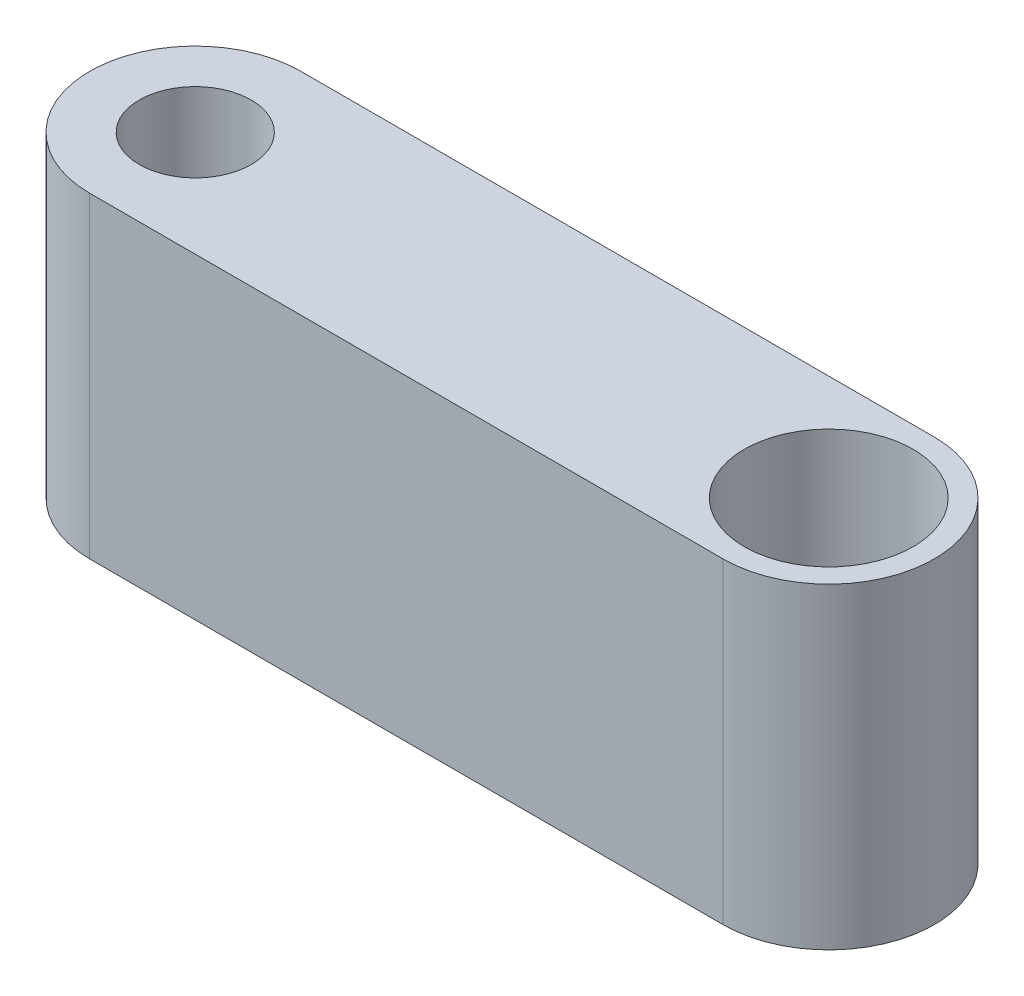
ISO-10303-21;
HEADER;
FILE_DESCRIPTION(('STEP AP214'),'2;1');
FILE_NAME('part.step','',(''),(''),'','','');
FILE_SCHEMA(('AUTOMOTIVE_DESIGN { 1 0 10303 214 1 1 1 1 }'));
ENDSEC;
DATA;
#1=APPLICATION_CONTEXT('core data for automotive mechanical design processes');
#2=APPLICATION_PROTOCOL_DEFINITION('international standard','automotive_design',2000,#1);
#3=PRODUCT_CONTEXT('',#1,'mechanical');
#4=PRODUCT('Part','Part','',(#3));
#5=PRODUCT_RELATED_PRODUCT_CATEGORY('part','',(#4));
#6=PRODUCT_DEFINITION_FORMATION('','',#4);
#7=PRODUCT_DEFINITION_CONTEXT('part definition',#1,'design');
#8=PRODUCT_DEFINITION('design','',#6,#7);
#9=PRODUCT_DEFINITION_SHAPE('','',#8);
#10=(LENGTH_UNIT() NAMED_UNIT(*) SI_UNIT(.MILLI.,.METRE.));
#11=(NAMED_UNIT(*) PLANE_ANGLE_UNIT() SI_UNIT($,.RADIAN.));
#12=(NAMED_UNIT(*) SI_UNIT($,.STERADIAN.) SOLID_ANGLE_UNIT());
#13=UNCERTAINTY_MEASURE_WITH_UNIT(LENGTH_MEASURE(1.E-05),#10,'distance_accuracy_value','');
#14=(GEOMETRIC_REPRESENTATION_CONTEXT(3) GLOBAL_UNCERTAINTY_ASSIGNED_CONTEXT((#13)) GLOBAL_UNIT_ASSIGNED_CONTEXT((#10,
#11,#12)) REPRESENTATION_CONTEXT('',''));
#15=CARTESIAN_POINT('',(0.,0.,0.));
#16=DIRECTION('',(0.,0.,1.));
#17=DIRECTION('',(1.,0.,0.));
#18=AXIS2_PLACEMENT_3D('',#15,#16,#17);
#19=CARTESIAN_POINT('',(-19.0049416082923,1.5,-20.602889707909));
#20=DIRECTION('',(0.,1.,0.));
#21=DIRECTION('',(0.,0.,1.));
#22=AXIS2_PLACEMENT_3D('',#19,#20,#21);
#23=PLANE('',#22);
#24=CARTESIAN_POINT('',(-19.0049416082923,1.5,-20.602889707909));
#25=DIRECTION('',(0.,1.,0.));
#26=DIRECTION('',(0.,0.,1.));
#27=AXIS2_PLACEMENT_3D('',#24,#25,#26);
#28=CIRCLE('',#27,0.265000000000001);
#29=CARTESIAN_POINT('',(-19.0049416082923,1.5,-20.337889707909));
#30=VERTEX_POINT('',#29);
#31=EDGE_CURVE('E112',#30,#30,#28,.T.);
#32=ORIENTED_EDGE('',*,*,#31,.F.);
#33=EDGE_LOOP('',(#32));
#34=FACE_BOUND('',#33,.T.);
#35=CARTESIAN_POINT('',(-19.0049416082923,1.5,-20.602889707909));
#36=DIRECTION('',(0.,1.,0.));
#37=DIRECTION('',(0.,0.,1.));
#38=AXIS2_PLACEMENT_3D('',#35,#36,#37);
#39=CIRCLE('',#38,0.5);
#40=CARTESIAN_POINT('',(-19.0049416082923,1.5,-21.102889707909));
#41=VERTEX_POINT('',#40);
#42=CARTESIAN_POINT('',(-19.0049416082923,1.5,-20.102889707909));
#43=VERTEX_POINT('',#42);
#44=EDGE_CURVE('E92',#41,#43,#39,.T.);
#45=ORIENTED_EDGE('',*,*,#44,.T.);
#46=DIRECTION('',(1.,0.,0.));
#47=VECTOR('',#46,1.);
#48=CARTESIAN_POINT('',(-19.0049416082923,1.5,-20.102889707909));
#49=LINE('',#48,#47);
#50=CARTESIAN_POINT('',(-16.0049416082923,1.5,-20.102889707909));
#51=VERTEX_POINT('',#50);
#52=EDGE_CURVE('E87',#43,#51,#49,.T.);
#53=ORIENTED_EDGE('',*,*,#52,.T.);
#54=CARTESIAN_POINT('',(-16.0049416082923,1.5,-20.602889707909));
#55=DIRECTION('',(0.,1.,0.));
#56=DIRECTION('',(0.,0.,1.));
#57=AXIS2_PLACEMENT_3D('',#54,#55,#56);
#58=CIRCLE('',#57,0.5);
#59=CARTESIAN_POINT('',(-16.0049416082923,1.5,-21.102889707909));
#60=VERTEX_POINT('',#59);
#61=EDGE_CURVE('E90',#51,#60,#58,.T.);
#62=ORIENTED_EDGE('',*,*,#61,.T.);
#63=DIRECTION('',(-1.,0.,0.));
#64=VECTOR('',#63,1.);
#65=CARTESIAN_POINT('',(-19.0049416082923,1.5,-21.102889707909));
#66=LINE('',#65,#64);
#67=EDGE_CURVE('E57',#60,#41,#66,.T.);
#68=ORIENTED_EDGE('',*,*,#67,.T.);
#69=EDGE_LOOP('',(#45,#53,#62,#68));
#70=FACE_BOUND('',#69,.T.);
#71=CARTESIAN_POINT('',(-16.0049416082923,1.5,-20.602889707909));
#72=DIRECTION('',(0.,1.,0.));
#73=DIRECTION('',(0.,0.,1.));
#74=AXIS2_PLACEMENT_3D('',#71,#72,#73);
#75=CIRCLE('',#74,0.4);
#76=CARTESIAN_POINT('',(-16.0049416082923,1.5,-20.202889707909));
#77=VERTEX_POINT('',#76);
#78=EDGE_CURVE('E134',#77,#77,#75,.T.);
#79=ORIENTED_EDGE('',*,*,#78,.F.);
#80=EDGE_LOOP('',(#79));
#81=FACE_BOUND('',#80,.T.);
#82=ADVANCED_FACE('F39',(#34,#70,#81),#23,.T.);
#83=CARTESIAN_POINT('',(-19.0049416082923,0.,-20.602889707909));
#84=DIRECTION('',(0.,1.,0.));
#85=DIRECTION('',(0.,0.,1.));
#86=AXIS2_PLACEMENT_3D('',#83,#84,#85);
#87=PLANE('',#86);
#88=CARTESIAN_POINT('',(-19.0049416082923,0.,-20.602889707909));
#89=DIRECTION('',(0.,1.,0.));
#90=DIRECTION('',(0.,0.,1.));
#91=AXIS2_PLACEMENT_3D('',#88,#89,#90);
#92=CIRCLE('',#91,0.5);
#93=CARTESIAN_POINT('',(-19.0049416082923,0.,-21.102889707909));
#94=VERTEX_POINT('',#93);
#95=CARTESIAN_POINT('',(-19.0049416082923,0.,-20.102889707909));
#96=VERTEX_POINT('',#95);
#97=EDGE_CURVE('E108',#94,#96,#92,.T.);
#98=ORIENTED_EDGE('',*,*,#97,.F.);
#99=DIRECTION('',(-1.,0.,0.));
#100=VECTOR('',#99,1.);
#101=CARTESIAN_POINT('',(-19.0049416082923,0.,-21.102889707909));
#102=LINE('',#101,#100);
#103=CARTESIAN_POINT('',(-16.0049416082923,0.,-21.102889707909));
#104=VERTEX_POINT('',#103);
#105=EDGE_CURVE('E80',#104,#94,#102,.T.);
#106=ORIENTED_EDGE('',*,*,#105,.F.);
#107=CARTESIAN_POINT('',(-16.0049416082923,0.,-20.602889707909));
#108=DIRECTION('',(0.,1.,0.));
#109=DIRECTION('',(0.,0.,1.));
#110=AXIS2_PLACEMENT_3D('',#107,#108,#109);
#111=CIRCLE('',#110,0.5);
#112=CARTESIAN_POINT('',(-16.0049416082923,0.,-20.102889707909));
#113=VERTEX_POINT('',#112);
#114=EDGE_CURVE('E74',#113,#104,#111,.T.);
#115=ORIENTED_EDGE('',*,*,#114,.F.);
#116=DIRECTION('',(1.,0.,0.));
#117=VECTOR('',#116,1.);
#118=CARTESIAN_POINT('',(-19.0049416082923,0.,-20.102889707909));
#119=LINE('',#118,#117);
#120=EDGE_CURVE('E97',#96,#113,#119,.T.);
#121=ORIENTED_EDGE('',*,*,#120,.F.);
#122=EDGE_LOOP('',(#98,#106,#115,#121));
#123=FACE_BOUND('',#122,.T.);
#124=CARTESIAN_POINT('',(-19.0049416082923,0.,-20.602889707909));
#125=DIRECTION('',(0.,1.,0.));
#126=DIRECTION('',(0.,0.,1.));
#127=AXIS2_PLACEMENT_3D('',#124,#125,#126);
#128=CIRCLE('',#127,0.265000000000001);
#129=CARTESIAN_POINT('',(-19.0049416082923,0.,-20.337889707909));
#130=VERTEX_POINT('',#129);
#131=EDGE_CURVE('E130',#130,#130,#128,.T.);
#132=ORIENTED_EDGE('',*,*,#131,.T.);
#133=EDGE_LOOP('',(#132));
#134=FACE_BOUND('',#133,.T.);
#135=CARTESIAN_POINT('',(-16.0049416082923,0.,-20.602889707909));
#136=DIRECTION('',(0.,1.,0.));
#137=DIRECTION('',(0.,0.,1.));
#138=AXIS2_PLACEMENT_3D('',#135,#136,#137);
#139=CIRCLE('',#138,0.4);
#140=CARTESIAN_POINT('',(-16.0049416082923,0.,-20.202889707909));
#141=VERTEX_POINT('',#140);
#142=EDGE_CURVE('E138',#141,#141,#139,.T.);
#143=ORIENTED_EDGE('',*,*,#142,.T.);
#144=EDGE_LOOP('',(#143));
#145=FACE_BOUND('',#144,.T.);
#146=ADVANCED_FACE('F125',(#123,#134,#145),#87,.F.);
#147=CARTESIAN_POINT('',(-19.0049416082923,1.5,-20.602889707909));
#148=DIRECTION('',(0.,-1.,0.));
#149=DIRECTION('',(0.,0.,-1.));
#150=AXIS2_PLACEMENT_3D('',#147,#148,#149);
#151=CYLINDRICAL_SURFACE('',#150,0.5);
#152=ORIENTED_EDGE('',*,*,#97,.T.);
#153=DIRECTION('',(0.,-1.,0.));
#154=VECTOR('',#153,1.);
#155=CARTESIAN_POINT('',(-19.0049416082923,1.5,-20.102889707909));
#156=LINE('',#155,#154);
#157=EDGE_CURVE('E11',#43,#96,#156,.T.);
#158=ORIENTED_EDGE('',*,*,#157,.F.);
#159=ORIENTED_EDGE('',*,*,#44,.F.);
#160=DIRECTION('',(0.,-1.,0.));
#161=VECTOR('',#160,1.);
#162=CARTESIAN_POINT('',(-19.0049416082923,1.5,-21.102889707909));
#163=LINE('',#162,#161);
#164=EDGE_CURVE('E104',#41,#94,#163,.T.);
#165=ORIENTED_EDGE('',*,*,#164,.T.);
#166=EDGE_LOOP('',(#152,#158,#159,#165));
#167=FACE_BOUND('',#166,.T.);
#168=ADVANCED_FACE('F41',(#167),#151,.T.);
#169=CARTESIAN_POINT('',(-19.0049416082923,1.5,-20.102889707909));
#170=DIRECTION('',(0.,0.,-1.));
#171=DIRECTION('',(-1.,0.,0.));
#172=AXIS2_PLACEMENT_3D('',#169,#170,#171);
#173=PLANE('',#172);
#174=ORIENTED_EDGE('',*,*,#120,.T.);
#175=DIRECTION('',(0.,-1.,0.));
#176=VECTOR('',#175,1.);
#177=CARTESIAN_POINT('',(-16.0049416082923,1.5,-20.102889707909));
#178=LINE('',#177,#176);
#179=EDGE_CURVE('E49',#51,#113,#178,.T.);
#180=ORIENTED_EDGE('',*,*,#179,.F.);
#181=ORIENTED_EDGE('',*,*,#52,.F.);
#182=ORIENTED_EDGE('',*,*,#157,.T.);
#183=EDGE_LOOP('',(#174,#180,#181,#182));
#184=FACE_BOUND('',#183,.T.);
#185=ADVANCED_FACE('F96',(#184),#173,.F.);
#186=CARTESIAN_POINT('',(-16.0049416082923,1.5,-20.602889707909));
#187=DIRECTION('',(0.,-1.,0.));
#188=DIRECTION('',(0.,0.,-1.));
#189=AXIS2_PLACEMENT_3D('',#186,#187,#188);
#190=CYLINDRICAL_SURFACE('',#189,0.5);
#191=ORIENTED_EDGE('',*,*,#114,.T.);
#192=DIRECTION('',(0.,-1.,0.));
#193=VECTOR('',#192,1.);
#194=CARTESIAN_POINT('',(-16.0049416082923,1.5,-21.102889707909));
#195=LINE('',#194,#193);
#196=EDGE_CURVE('E99',#60,#104,#195,.T.);
#197=ORIENTED_EDGE('',*,*,#196,.F.);
#198=ORIENTED_EDGE('',*,*,#61,.F.);
#199=ORIENTED_EDGE('',*,*,#179,.T.);
#200=EDGE_LOOP('',(#191,#197,#198,#199));
#201=FACE_BOUND('',#200,.T.);
#202=ADVANCED_FACE('F100',(#201),#190,.T.);
#203=CARTESIAN_POINT('',(-19.0049416082923,1.5,-21.102889707909));
#204=DIRECTION('',(0.,0.,1.));
#205=DIRECTION('',(1.,0.,0.));
#206=AXIS2_PLACEMENT_3D('',#203,#204,#205);
#207=PLANE('',#206);
#208=ORIENTED_EDGE('',*,*,#105,.T.);
#209=ORIENTED_EDGE('',*,*,#164,.F.);
#210=ORIENTED_EDGE('',*,*,#67,.F.);
#211=ORIENTED_EDGE('',*,*,#196,.T.);
#212=EDGE_LOOP('',(#208,#209,#210,#211));
#213=FACE_BOUND('',#212,.T.);
#214=ADVANCED_FACE('F122',(#213),#207,.F.);
#215=CARTESIAN_POINT('',(-19.0049416082923,1.5,-20.602889707909));
#216=DIRECTION('',(0.,-1.,0.));
#217=DIRECTION('',(0.,0.,-1.));
#218=AXIS2_PLACEMENT_3D('',#215,#216,#217);
#219=CYLINDRICAL_SURFACE('',#218,0.265000000000001);
#220=ORIENTED_EDGE('',*,*,#31,.T.);
#221=EDGE_LOOP('',(#220));
#222=FACE_BOUND('',#221,.T.);
#223=ORIENTED_EDGE('',*,*,#131,.F.);
#224=EDGE_LOOP('',(#223));
#225=FACE_BOUND('',#224,.T.);
#226=ADVANCED_FACE('F157',(#222,#225),#219,.F.);
#227=CARTESIAN_POINT('',(-16.0049416082923,1.5,-20.602889707909));
#228=DIRECTION('',(0.,-1.,0.));
#229=DIRECTION('',(0.,0.,-1.));
#230=AXIS2_PLACEMENT_3D('',#227,#228,#229);
#231=CYLINDRICAL_SURFACE('',#230,0.4);
#232=ORIENTED_EDGE('',*,*,#78,.T.);
#233=EDGE_LOOP('',(#232));
#234=FACE_BOUND('',#233,.T.);
#235=ORIENTED_EDGE('',*,*,#142,.F.);
#236=EDGE_LOOP('',(#235));
#237=FACE_BOUND('',#236,.T.);
#238=ADVANCED_FACE('F146',(#234,#237),#231,.F.);
#239=CLOSED_SHELL('',(#82,#146,#168,#185,#202,#214,#226,#238));
#240=MANIFOLD_SOLID_BREP('B2',#239);
#241=ADVANCED_BREP_SHAPE_REPRESENTATION('',(#18,#240),#14);
#242=SHAPE_DEFINITION_REPRESENTATION(#9,#241);
ENDSEC;
END-ISO-10303-21;
